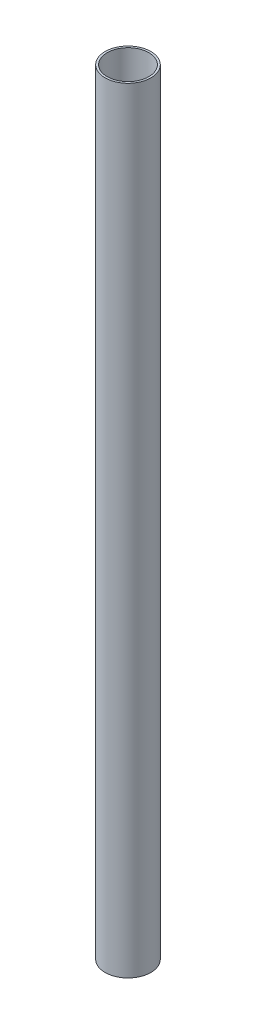
ISO-10303-21;
HEADER;
FILE_DESCRIPTION(('STEP AP214'),'2;1');
FILE_NAME('part.step','',(''),(''),'','','');
FILE_SCHEMA(('AUTOMOTIVE_DESIGN { 1 0 10303 214 1 1 1 1 }'));
ENDSEC;
DATA;
#1=APPLICATION_CONTEXT('core data for automotive mechanical design processes');
#2=APPLICATION_PROTOCOL_DEFINITION('international standard','automotive_design',2000,#1);
#3=PRODUCT_CONTEXT('',#1,'mechanical');
#4=PRODUCT('Part','Part','',(#3));
#5=PRODUCT_RELATED_PRODUCT_CATEGORY('part','',(#4));
#6=PRODUCT_DEFINITION_FORMATION('','',#4);
#7=PRODUCT_DEFINITION_CONTEXT('part definition',#1,'design');
#8=PRODUCT_DEFINITION('design','',#6,#7);
#9=PRODUCT_DEFINITION_SHAPE('','',#8);
#10=(LENGTH_UNIT() NAMED_UNIT(*) SI_UNIT(.MILLI.,.METRE.));
#11=(NAMED_UNIT(*) PLANE_ANGLE_UNIT() SI_UNIT($,.RADIAN.));
#12=(NAMED_UNIT(*) SI_UNIT($,.STERADIAN.) SOLID_ANGLE_UNIT());
#13=UNCERTAINTY_MEASURE_WITH_UNIT(LENGTH_MEASURE(1.E-05),#10,'distance_accuracy_value','');
#14=(GEOMETRIC_REPRESENTATION_CONTEXT(3) GLOBAL_UNCERTAINTY_ASSIGNED_CONTEXT((#13)) GLOBAL_UNIT_ASSIGNED_CONTEXT((#10,
#11,#12)) REPRESENTATION_CONTEXT('',''));
#15=CARTESIAN_POINT('',(0.,0.,0.));
#16=DIRECTION('',(0.,0.,1.));
#17=DIRECTION('',(1.,0.,0.));
#18=AXIS2_PLACEMENT_3D('',#15,#16,#17);
#19=CARTESIAN_POINT('',(0.,508.,0.));
#20=DIRECTION('',(0.,1.,0.));
#21=DIRECTION('',(0.,0.,1.));
#22=AXIS2_PLACEMENT_3D('',#19,#20,#21);
#23=PLANE('',#22);
#24=CARTESIAN_POINT('',(0.,508.,0.));
#25=DIRECTION('',(0.,1.,0.));
#26=DIRECTION('',(0.,0.,1.));
#27=AXIS2_PLACEMENT_3D('',#24,#25,#26);
#28=CIRCLE('',#27,14.986);
#29=CARTESIAN_POINT('',(0.,508.,14.986));
#30=VERTEX_POINT('',#29);
#31=EDGE_CURVE('E10',#30,#30,#28,.T.);
#32=ORIENTED_EDGE('',*,*,#31,.T.);
#33=EDGE_LOOP('',(#32));
#34=FACE_BOUND('',#33,.T.);
#35=CARTESIAN_POINT('',(0.,508.,0.));
#36=DIRECTION('',(0.,1.,0.));
#37=DIRECTION('',(0.,0.,1.));
#38=AXIS2_PLACEMENT_3D('',#35,#36,#37);
#39=CIRCLE('',#38,13.6525);
#40=CARTESIAN_POINT('',(0.,508.,13.6525));
#41=VERTEX_POINT('',#40);
#42=EDGE_CURVE('E42',#41,#41,#39,.T.);
#43=ORIENTED_EDGE('',*,*,#42,.F.);
#44=EDGE_LOOP('',(#43));
#45=FACE_BOUND('',#44,.T.);
#46=ADVANCED_FACE('F31',(#34,#45),#23,.T.);
#47=CARTESIAN_POINT('',(0.,0.,0.));
#48=DIRECTION('',(0.,1.,0.));
#49=DIRECTION('',(0.,0.,1.));
#50=AXIS2_PLACEMENT_3D('',#47,#48,#49);
#51=PLANE('',#50);
#52=CARTESIAN_POINT('',(0.,0.,0.));
#53=DIRECTION('',(0.,1.,0.));
#54=DIRECTION('',(0.,0.,1.));
#55=AXIS2_PLACEMENT_3D('',#52,#53,#54);
#56=CIRCLE('',#55,14.986);
#57=CARTESIAN_POINT('',(0.,0.,14.986));
#58=VERTEX_POINT('',#57);
#59=EDGE_CURVE('E35',#58,#58,#56,.T.);
#60=ORIENTED_EDGE('',*,*,#59,.F.);
#61=EDGE_LOOP('',(#60));
#62=FACE_BOUND('',#61,.T.);
#63=CARTESIAN_POINT('',(0.,0.,0.));
#64=DIRECTION('',(0.,1.,0.));
#65=DIRECTION('',(0.,0.,1.));
#66=AXIS2_PLACEMENT_3D('',#63,#64,#65);
#67=CIRCLE('',#66,13.6525);
#68=CARTESIAN_POINT('',(0.,0.,13.6525));
#69=VERTEX_POINT('',#68);
#70=EDGE_CURVE('E44',#69,#69,#67,.T.);
#71=ORIENTED_EDGE('',*,*,#70,.T.);
#72=EDGE_LOOP('',(#71));
#73=FACE_BOUND('',#72,.T.);
#74=ADVANCED_FACE('F54',(#62,#73),#51,.F.);
#75=CARTESIAN_POINT('',(0.,508.,0.));
#76=DIRECTION('',(0.,-1.,0.));
#77=DIRECTION('',(0.,0.,-1.));
#78=AXIS2_PLACEMENT_3D('',#75,#76,#77);
#79=CYLINDRICAL_SURFACE('',#78,14.986);
#80=ORIENTED_EDGE('',*,*,#31,.F.);
#81=EDGE_LOOP('',(#80));
#82=FACE_BOUND('',#81,.T.);
#83=ORIENTED_EDGE('',*,*,#59,.T.);
#84=EDGE_LOOP('',(#83));
#85=FACE_BOUND('',#84,.T.);
#86=ADVANCED_FACE('F33',(#82,#85),#79,.T.);
#87=CARTESIAN_POINT('',(0.,508.,0.));
#88=DIRECTION('',(0.,-1.,0.));
#89=DIRECTION('',(0.,0.,-1.));
#90=AXIS2_PLACEMENT_3D('',#87,#88,#89);
#91=CYLINDRICAL_SURFACE('',#90,13.6525);
#92=ORIENTED_EDGE('',*,*,#42,.T.);
#93=EDGE_LOOP('',(#92));
#94=FACE_BOUND('',#93,.T.);
#95=ORIENTED_EDGE('',*,*,#70,.F.);
#96=EDGE_LOOP('',(#95));
#97=FACE_BOUND('',#96,.T.);
#98=ADVANCED_FACE('F50',(#94,#97),#91,.F.);
#99=CLOSED_SHELL('',(#46,#74,#86,#98));
#100=MANIFOLD_SOLID_BREP('B2',#99);
#101=ADVANCED_BREP_SHAPE_REPRESENTATION('',(#18,#100),#14);
#102=SHAPE_DEFINITION_REPRESENTATION(#9,#101);
ENDSEC;
END-ISO-10303-21;
